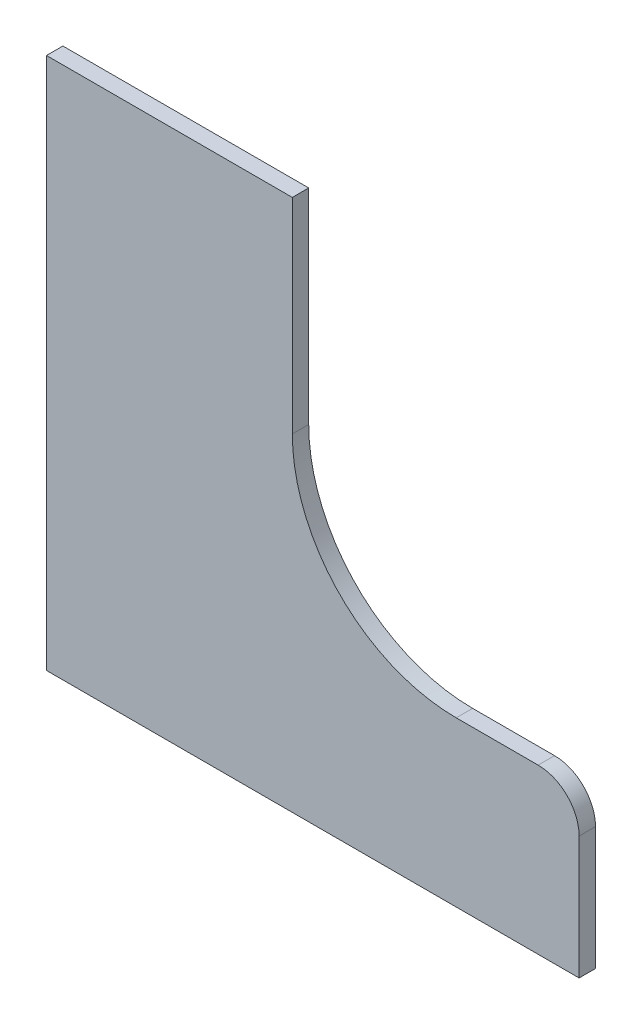
ISO-10303-21;
HEADER;
FILE_DESCRIPTION(('STEP AP214'),'2;1');
FILE_NAME('part.step','',(''),(''),'','','');
FILE_SCHEMA(('AUTOMOTIVE_DESIGN { 1 0 10303 214 1 1 1 1 }'));
ENDSEC;
DATA;
#1=APPLICATION_CONTEXT('core data for automotive mechanical design processes');
#2=APPLICATION_PROTOCOL_DEFINITION('international standard','automotive_design',2000,#1);
#3=PRODUCT_CONTEXT('',#1,'mechanical');
#4=PRODUCT('Part','Part','',(#3));
#5=PRODUCT_RELATED_PRODUCT_CATEGORY('part','',(#4));
#6=PRODUCT_DEFINITION_FORMATION('','',#4);
#7=PRODUCT_DEFINITION_CONTEXT('part definition',#1,'design');
#8=PRODUCT_DEFINITION('design','',#6,#7);
#9=PRODUCT_DEFINITION_SHAPE('','',#8);
#10=(LENGTH_UNIT() NAMED_UNIT(*) SI_UNIT(.MILLI.,.METRE.));
#11=(NAMED_UNIT(*) PLANE_ANGLE_UNIT() SI_UNIT($,.RADIAN.));
#12=(NAMED_UNIT(*) SI_UNIT($,.STERADIAN.) SOLID_ANGLE_UNIT());
#13=UNCERTAINTY_MEASURE_WITH_UNIT(LENGTH_MEASURE(1.E-05),#10,'distance_accuracy_value','');
#14=(GEOMETRIC_REPRESENTATION_CONTEXT(3) GLOBAL_UNCERTAINTY_ASSIGNED_CONTEXT((#13)) GLOBAL_UNIT_ASSIGNED_CONTEXT((#10,
#11,#12)) REPRESENTATION_CONTEXT('',''));
#15=CARTESIAN_POINT('',(0.,0.,0.));
#16=DIRECTION('',(0.,0.,1.));
#17=DIRECTION('',(1.,0.,0.));
#18=AXIS2_PLACEMENT_3D('',#15,#16,#17);
#19=CARTESIAN_POINT('',(-482.666666666666,166.,20.));
#20=DIRECTION('',(1.,0.,0.));
#21=DIRECTION('',(0.,1.,0.));
#22=AXIS2_PLACEMENT_3D('',#19,#20,#21);
#23=PLANE('',#22);
#24=DIRECTION('',(0.,-1.,0.));
#25=VECTOR('',#24,1.);
#26=CARTESIAN_POINT('',(-482.666666666666,166.,0.));
#27=LINE('',#26,#25);
#28=CARTESIAN_POINT('',(-482.666666666666,166.,0.));
#29=VERTEX_POINT('',#28);
#30=CARTESIAN_POINT('',(-482.666666666666,-484.,0.));
#31=VERTEX_POINT('',#30);
#32=EDGE_CURVE('E129',#29,#31,#27,.T.);
#33=ORIENTED_EDGE('',*,*,#32,.T.);
#34=DIRECTION('',(0.,0.,-1.));
#35=VECTOR('',#34,1.);
#36=CARTESIAN_POINT('',(-482.666666666666,-484.,20.));
#37=LINE('',#36,#35);
#38=CARTESIAN_POINT('',(-482.666666666666,-484.,20.));
#39=VERTEX_POINT('',#38);
#40=EDGE_CURVE('E109',#39,#31,#37,.T.);
#41=ORIENTED_EDGE('',*,*,#40,.F.);
#42=DIRECTION('',(0.,-1.,0.));
#43=VECTOR('',#42,1.);
#44=CARTESIAN_POINT('',(-482.666666666666,166.,20.));
#45=LINE('',#44,#43);
#46=CARTESIAN_POINT('',(-482.666666666666,166.,20.));
#47=VERTEX_POINT('',#46);
#48=EDGE_CURVE('E116',#47,#39,#45,.T.);
#49=ORIENTED_EDGE('',*,*,#48,.F.);
#50=DIRECTION('',(0.,0.,-1.));
#51=VECTOR('',#50,1.);
#52=CARTESIAN_POINT('',(-482.666666666666,166.,20.));
#53=LINE('',#52,#51);
#54=EDGE_CURVE('E154',#47,#29,#53,.T.);
#55=ORIENTED_EDGE('',*,*,#54,.T.);
#56=EDGE_LOOP('',(#33,#41,#49,#55));
#57=FACE_BOUND('',#56,.T.);
#58=ADVANCED_FACE('F39',(#57),#23,.F.);
#59=CARTESIAN_POINT('',(-482.666666666666,-484.,20.));
#60=DIRECTION('',(0.,1.,0.));
#61=DIRECTION('',(0.,0.,1.));
#62=AXIS2_PLACEMENT_3D('',#59,#60,#61);
#63=PLANE('',#62);
#64=DIRECTION('',(1.,0.,0.));
#65=VECTOR('',#64,1.);
#66=CARTESIAN_POINT('',(-482.666666666666,-484.,0.));
#67=LINE('',#66,#65);
#68=CARTESIAN_POINT('',(167.333333333334,-484.,0.));
#69=VERTEX_POINT('',#68);
#70=EDGE_CURVE('E171',#31,#69,#67,.T.);
#71=ORIENTED_EDGE('',*,*,#70,.T.);
#72=DIRECTION('',(0.,0.,-1.));
#73=VECTOR('',#72,1.);
#74=CARTESIAN_POINT('',(167.333333333334,-484.,20.));
#75=LINE('',#74,#73);
#76=CARTESIAN_POINT('',(167.333333333334,-484.,20.));
#77=VERTEX_POINT('',#76);
#78=EDGE_CURVE('E112',#77,#69,#75,.T.);
#79=ORIENTED_EDGE('',*,*,#78,.F.);
#80=DIRECTION('',(1.,0.,0.));
#81=VECTOR('',#80,1.);
#82=CARTESIAN_POINT('',(-482.666666666666,-484.,20.));
#83=LINE('',#82,#81);
#84=EDGE_CURVE('E105',#39,#77,#83,.T.);
#85=ORIENTED_EDGE('',*,*,#84,.F.);
#86=ORIENTED_EDGE('',*,*,#40,.T.);
#87=EDGE_LOOP('',(#71,#79,#85,#86));
#88=FACE_BOUND('',#87,.T.);
#89=ADVANCED_FACE('F107',(#88),#63,.F.);
#90=CARTESIAN_POINT('',(167.333333333334,-284.,20.));
#91=DIRECTION('',(-1.,0.,0.));
#92=DIRECTION('',(0.,0.,1.));
#93=AXIS2_PLACEMENT_3D('',#90,#91,#92);
#94=PLANE('',#93);
#95=DIRECTION('',(0.,1.,0.));
#96=VECTOR('',#95,1.);
#97=CARTESIAN_POINT('',(167.333333333334,-284.,0.));
#98=LINE('',#97,#96);
#99=CARTESIAN_POINT('',(167.333333333334,-334.,0.));
#100=VERTEX_POINT('',#99);
#101=EDGE_CURVE('E168',#69,#100,#98,.T.);
#102=ORIENTED_EDGE('',*,*,#101,.T.);
#103=DIRECTION('',(0.,0.,-1.));
#104=VECTOR('',#103,1.);
#105=CARTESIAN_POINT('',(167.333333333334,-334.,20.));
#106=LINE('',#105,#104);
#107=CARTESIAN_POINT('',(167.333333333334,-334.,20.));
#108=VERTEX_POINT('',#107);
#109=EDGE_CURVE('E48',#100,#108,#106,.F.);
#110=ORIENTED_EDGE('',*,*,#109,.T.);
#111=DIRECTION('',(0.,1.,0.));
#112=VECTOR('',#111,1.);
#113=CARTESIAN_POINT('',(167.333333333334,-284.,20.));
#114=LINE('',#113,#112);
#115=EDGE_CURVE('E115',#77,#108,#114,.T.);
#116=ORIENTED_EDGE('',*,*,#115,.F.);
#117=ORIENTED_EDGE('',*,*,#78,.T.);
#118=EDGE_LOOP('',(#102,#110,#116,#117));
#119=FACE_BOUND('',#118,.T.);
#120=ADVANCED_FACE('F209',(#119),#94,.F.);
#121=CARTESIAN_POINT('',(17.3333333333335,-284.,20.));
#122=DIRECTION('',(0.,-1.,0.));
#123=DIRECTION('',(0.,0.,-1.));
#124=AXIS2_PLACEMENT_3D('',#121,#122,#123);
#125=PLANE('',#124);
#126=DIRECTION('',(-1.,0.,0.));
#127=VECTOR('',#126,1.);
#128=CARTESIAN_POINT('',(17.3333333333335,-284.,20.));
#129=LINE('',#128,#127);
#130=CARTESIAN_POINT('',(117.333333333334,-284.,20.));
#131=VERTEX_POINT('',#130);
#132=CARTESIAN_POINT('',(17.3333333333336,-284.,20.));
#133=VERTEX_POINT('',#132);
#134=EDGE_CURVE('E184',#131,#133,#129,.T.);
#135=ORIENTED_EDGE('',*,*,#134,.F.);
#136=DIRECTION('',(0.,0.,-1.));
#137=VECTOR('',#136,1.);
#138=CARTESIAN_POINT('',(117.333333333334,-284.,20.));
#139=LINE('',#138,#137);
#140=CARTESIAN_POINT('',(117.333333333334,-284.,0.));
#141=VERTEX_POINT('',#140);
#142=EDGE_CURVE('E131',#131,#141,#139,.T.);
#143=ORIENTED_EDGE('',*,*,#142,.T.);
#144=DIRECTION('',(-1.,0.,0.));
#145=VECTOR('',#144,1.);
#146=CARTESIAN_POINT('',(17.3333333333335,-284.,0.));
#147=LINE('',#146,#145);
#148=CARTESIAN_POINT('',(17.3333333333336,-284.,0.));
#149=VERTEX_POINT('',#148);
#150=EDGE_CURVE('E165',#141,#149,#147,.T.);
#151=ORIENTED_EDGE('',*,*,#150,.T.);
#152=DIRECTION('',(0.,0.,-1.));
#153=VECTOR('',#152,1.);
#154=CARTESIAN_POINT('',(17.3333333333336,-284.,20.));
#155=LINE('',#154,#153);
#156=EDGE_CURVE('E137',#133,#149,#155,.T.);
#157=ORIENTED_EDGE('',*,*,#156,.F.);
#158=EDGE_LOOP('',(#135,#143,#151,#157));
#159=FACE_BOUND('',#158,.T.);
#160=ADVANCED_FACE('F193',(#159),#125,.F.);
#161=CARTESIAN_POINT('',(17.3333333333336,-83.9999999999998,20.));
#162=DIRECTION('',(0.,0.,-1.));
#163=DIRECTION('',(-1.,0.,0.));
#164=AXIS2_PLACEMENT_3D('',#161,#162,#163);
#165=CYLINDRICAL_SURFACE('',#164,200.);
#166=CARTESIAN_POINT('',(17.3333333333336,-83.9999999999998,0.));
#167=DIRECTION('',(0.,0.,-1.));
#168=DIRECTION('',(-1.,0.,0.));
#169=AXIS2_PLACEMENT_3D('',#166,#167,#168);
#170=CIRCLE('',#169,200.);
#171=CARTESIAN_POINT('',(-182.666666666666,-83.9999999999998,0.));
#172=VERTEX_POINT('',#171);
#173=EDGE_CURVE('E162',#149,#172,#170,.T.);
#174=ORIENTED_EDGE('',*,*,#173,.T.);
#175=DIRECTION('',(0.,0.,-1.));
#176=VECTOR('',#175,1.);
#177=CARTESIAN_POINT('',(-182.666666666666,-83.9999999999998,20.));
#178=LINE('',#177,#176);
#179=CARTESIAN_POINT('',(-182.666666666666,-83.9999999999998,20.));
#180=VERTEX_POINT('',#179);
#181=EDGE_CURVE('E146',#180,#172,#178,.T.);
#182=ORIENTED_EDGE('',*,*,#181,.F.);
#183=CARTESIAN_POINT('',(17.3333333333336,-83.9999999999998,20.));
#184=DIRECTION('',(0.,0.,-1.));
#185=DIRECTION('',(-1.,0.,0.));
#186=AXIS2_PLACEMENT_3D('',#183,#184,#185);
#187=CIRCLE('',#186,200.);
#188=EDGE_CURVE('E181',#133,#180,#187,.T.);
#189=ORIENTED_EDGE('',*,*,#188,.F.);
#190=ORIENTED_EDGE('',*,*,#156,.T.);
#191=EDGE_LOOP('',(#174,#182,#189,#190));
#192=FACE_BOUND('',#191,.T.);
#193=ADVANCED_FACE('F201',(#192),#165,.F.);
#194=CARTESIAN_POINT('',(-182.666666666666,166.,20.));
#195=DIRECTION('',(-1.,0.,0.));
#196=DIRECTION('',(0.,-1.,0.));
#197=AXIS2_PLACEMENT_3D('',#194,#195,#196);
#198=PLANE('',#197);
#199=DIRECTION('',(0.,1.,0.));
#200=VECTOR('',#199,1.);
#201=CARTESIAN_POINT('',(-182.666666666666,166.,0.));
#202=LINE('',#201,#200);
#203=CARTESIAN_POINT('',(-182.666666666666,166.,0.));
#204=VERTEX_POINT('',#203);
#205=EDGE_CURVE('E159',#172,#204,#202,.T.);
#206=ORIENTED_EDGE('',*,*,#205,.T.);
#207=DIRECTION('',(0.,0.,-1.));
#208=VECTOR('',#207,1.);
#209=CARTESIAN_POINT('',(-182.666666666666,166.,20.));
#210=LINE('',#209,#208);
#211=CARTESIAN_POINT('',(-182.666666666666,166.,20.));
#212=VERTEX_POINT('',#211);
#213=EDGE_CURVE('E150',#212,#204,#210,.T.);
#214=ORIENTED_EDGE('',*,*,#213,.F.);
#215=DIRECTION('',(0.,1.,0.));
#216=VECTOR('',#215,1.);
#217=CARTESIAN_POINT('',(-182.666666666666,166.,20.));
#218=LINE('',#217,#216);
#219=EDGE_CURVE('E178',#180,#212,#218,.T.);
#220=ORIENTED_EDGE('',*,*,#219,.F.);
#221=ORIENTED_EDGE('',*,*,#181,.T.);
#222=EDGE_LOOP('',(#206,#214,#220,#221));
#223=FACE_BOUND('',#222,.T.);
#224=ADVANCED_FACE('F205',(#223),#198,.F.);
#225=CARTESIAN_POINT('',(-482.666666666666,166.,20.));
#226=DIRECTION('',(0.,-1.,0.));
#227=DIRECTION('',(0.,0.,-1.));
#228=AXIS2_PLACEMENT_3D('',#225,#226,#227);
#229=PLANE('',#228);
#230=DIRECTION('',(-1.,0.,0.));
#231=VECTOR('',#230,1.);
#232=CARTESIAN_POINT('',(-482.666666666666,166.,0.));
#233=LINE('',#232,#231);
#234=EDGE_CURVE('E126',#204,#29,#233,.T.);
#235=ORIENTED_EDGE('',*,*,#234,.T.);
#236=ORIENTED_EDGE('',*,*,#54,.F.);
#237=DIRECTION('',(-1.,0.,0.));
#238=VECTOR('',#237,1.);
#239=CARTESIAN_POINT('',(-482.666666666666,166.,20.));
#240=LINE('',#239,#238);
#241=EDGE_CURVE('E121',#212,#47,#240,.T.);
#242=ORIENTED_EDGE('',*,*,#241,.F.);
#243=ORIENTED_EDGE('',*,*,#213,.T.);
#244=EDGE_LOOP('',(#235,#236,#242,#243));
#245=FACE_BOUND('',#244,.T.);
#246=ADVANCED_FACE('F208',(#245),#229,.F.);
#247=CARTESIAN_POINT('',(17.3333333333336,-83.9999999999998,20.));
#248=DIRECTION('',(0.,0.,-1.));
#249=DIRECTION('',(-1.,0.,0.));
#250=AXIS2_PLACEMENT_3D('',#247,#248,#249);
#251=PLANE('',#250);
#252=ORIENTED_EDGE('',*,*,#115,.T.);
#253=CARTESIAN_POINT('',(117.333333333334,-334.,20.));
#254=DIRECTION('',(0.,0.,-1.));
#255=DIRECTION('',(-1.,0.,0.));
#256=AXIS2_PLACEMENT_3D('',#253,#254,#255);
#257=CIRCLE('',#256,50.);
#258=EDGE_CURVE('E11',#108,#131,#257,.F.);
#259=ORIENTED_EDGE('',*,*,#258,.T.);
#260=ORIENTED_EDGE('',*,*,#134,.T.);
#261=ORIENTED_EDGE('',*,*,#188,.T.);
#262=ORIENTED_EDGE('',*,*,#219,.T.);
#263=ORIENTED_EDGE('',*,*,#241,.T.);
#264=ORIENTED_EDGE('',*,*,#48,.T.);
#265=ORIENTED_EDGE('',*,*,#84,.T.);
#266=EDGE_LOOP('',(#252,#259,#260,#261,#262,#263,#264,#265));
#267=FACE_BOUND('',#266,.T.);
#268=ADVANCED_FACE('F119',(#267),#251,.F.);
#269=CARTESIAN_POINT('',(17.3333333333336,-83.9999999999998,0.));
#270=DIRECTION('',(0.,0.,-1.));
#271=DIRECTION('',(-1.,0.,0.));
#272=AXIS2_PLACEMENT_3D('',#269,#270,#271);
#273=PLANE('',#272);
#274=ORIENTED_EDGE('',*,*,#150,.F.);
#275=CARTESIAN_POINT('',(117.333333333334,-334.,0.));
#276=DIRECTION('',(0.,0.,-1.));
#277=DIRECTION('',(-1.,0.,0.));
#278=AXIS2_PLACEMENT_3D('',#275,#276,#277);
#279=CIRCLE('',#278,50.);
#280=EDGE_CURVE('E62',#141,#100,#279,.T.);
#281=ORIENTED_EDGE('',*,*,#280,.T.);
#282=ORIENTED_EDGE('',*,*,#101,.F.);
#283=ORIENTED_EDGE('',*,*,#70,.F.);
#284=ORIENTED_EDGE('',*,*,#32,.F.);
#285=ORIENTED_EDGE('',*,*,#234,.F.);
#286=ORIENTED_EDGE('',*,*,#205,.F.);
#287=ORIENTED_EDGE('',*,*,#173,.F.);
#288=EDGE_LOOP('',(#274,#281,#282,#283,#284,#285,#286,#287));
#289=FACE_BOUND('',#288,.T.);
#290=ADVANCED_FACE('F196',(#289),#273,.T.);
#291=CARTESIAN_POINT('',(117.333333333334,-334.,20.));
#292=DIRECTION('',(0.,0.,-1.));
#293=DIRECTION('',(-1.,0.,0.));
#294=AXIS2_PLACEMENT_3D('',#291,#292,#293);
#295=CYLINDRICAL_SURFACE('',#294,50.);
#296=ORIENTED_EDGE('',*,*,#258,.F.);
#297=ORIENTED_EDGE('',*,*,#109,.F.);
#298=ORIENTED_EDGE('',*,*,#280,.F.);
#299=ORIENTED_EDGE('',*,*,#142,.F.);
#300=EDGE_LOOP('',(#296,#297,#298,#299));
#301=FACE_BOUND('',#300,.T.);
#302=ADVANCED_FACE('F41',(#301),#295,.T.);
#303=CLOSED_SHELL('',(#58,#89,#120,#160,#193,#224,#246,#268,#290,#302));
#304=MANIFOLD_SOLID_BREP('B2',#303);
#305=ADVANCED_BREP_SHAPE_REPRESENTATION('',(#18,#304),#14);
#306=SHAPE_DEFINITION_REPRESENTATION(#9,#305);
ENDSEC;
END-ISO-10303-21;
